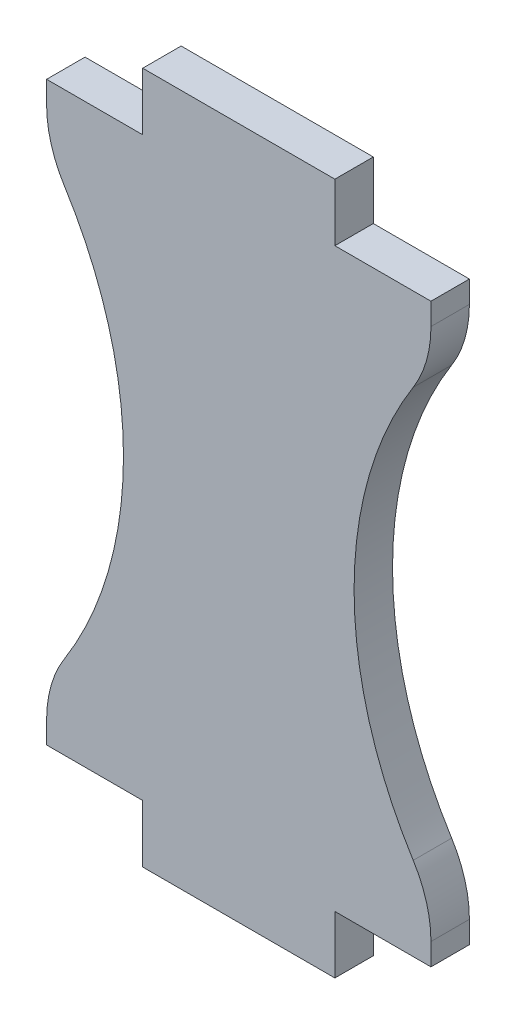
ISO-10303-21;
HEADER;
FILE_DESCRIPTION(('STEP AP214'),'2;1');
FILE_NAME('part.step','',(''),(''),'','','');
FILE_SCHEMA(('AUTOMOTIVE_DESIGN { 1 0 10303 214 1 1 1 1 }'));
ENDSEC;
DATA;
#1=APPLICATION_CONTEXT('core data for automotive mechanical design processes');
#2=APPLICATION_PROTOCOL_DEFINITION('international standard','automotive_design',2000,#1);
#3=PRODUCT_CONTEXT('',#1,'mechanical');
#4=PRODUCT('Part','Part','',(#3));
#5=PRODUCT_RELATED_PRODUCT_CATEGORY('part','',(#4));
#6=PRODUCT_DEFINITION_FORMATION('','',#4);
#7=PRODUCT_DEFINITION_CONTEXT('part definition',#1,'design');
#8=PRODUCT_DEFINITION('design','',#6,#7);
#9=PRODUCT_DEFINITION_SHAPE('','',#8);
#10=(LENGTH_UNIT() NAMED_UNIT(*) SI_UNIT(.MILLI.,.METRE.));
#11=(NAMED_UNIT(*) PLANE_ANGLE_UNIT() SI_UNIT($,.RADIAN.));
#12=(NAMED_UNIT(*) SI_UNIT($,.STERADIAN.) SOLID_ANGLE_UNIT());
#13=UNCERTAINTY_MEASURE_WITH_UNIT(LENGTH_MEASURE(1.E-05),#10,'distance_accuracy_value','');
#14=(GEOMETRIC_REPRESENTATION_CONTEXT(3) GLOBAL_UNCERTAINTY_ASSIGNED_CONTEXT((#13)) GLOBAL_UNIT_ASSIGNED_CONTEXT((#10,
#11,#12)) REPRESENTATION_CONTEXT('',''));
#15=CARTESIAN_POINT('',(0.,0.,0.));
#16=DIRECTION('',(0.,0.,1.));
#17=DIRECTION('',(1.,0.,0.));
#18=AXIS2_PLACEMENT_3D('',#15,#16,#17);
#19=CARTESIAN_POINT('',(26.000000000027,17.9999999999766,2.));
#20=DIRECTION('',(0.,0.,-1.));
#21=DIRECTION('',(-1.,0.,0.));
#22=AXIS2_PLACEMENT_3D('',#19,#20,#21);
#23=CYLINDRICAL_SURFACE('',#22,20.0000000000365);
#24=CARTESIAN_POINT('',(26.000000000027,17.9999999999766,0.));
#25=DIRECTION('',(0.,0.,-1.));
#26=DIRECTION('',(1.,0.,0.));
#27=AXIS2_PLACEMENT_3D('',#24,#25,#26);
#28=CIRCLE('',#27,20.0000000000365);
#29=CARTESIAN_POINT('',(9.07692307692156,7.34122579952961,0.));
#30=VERTEX_POINT('',#29);
#31=CARTESIAN_POINT('',(9.07692307692684,28.658774200432,0.));
#32=VERTEX_POINT('',#31);
#33=EDGE_CURVE('E203',#30,#32,#28,.T.);
#34=ORIENTED_EDGE('',*,*,#33,.T.);
#35=DIRECTION('',(0.,0.,-1.));
#36=VECTOR('',#35,1.);
#37=CARTESIAN_POINT('',(9.07692307692684,28.658774200432,2.));
#38=LINE('',#37,#36);
#39=CARTESIAN_POINT('',(9.07692307692684,28.658774200432,2.));
#40=VERTEX_POINT('',#39);
#41=EDGE_CURVE('E11',#40,#32,#38,.T.);
#42=ORIENTED_EDGE('',*,*,#41,.F.);
#43=CARTESIAN_POINT('',(26.000000000027,17.9999999999766,2.));
#44=DIRECTION('',(0.,0.,-1.));
#45=DIRECTION('',(1.,0.,0.));
#46=AXIS2_PLACEMENT_3D('',#43,#44,#45);
#47=CIRCLE('',#46,20.0000000000365);
#48=CARTESIAN_POINT('',(9.07692307692156,7.34122579952961,2.));
#49=VERTEX_POINT('',#48);
#50=EDGE_CURVE('E241',#49,#40,#47,.T.);
#51=ORIENTED_EDGE('',*,*,#50,.F.);
#52=DIRECTION('',(0.,0.,-1.));
#53=VECTOR('',#52,1.);
#54=CARTESIAN_POINT('',(9.07692307692156,7.34122579952961,2.));
#55=LINE('',#54,#53);
#56=EDGE_CURVE('E199',#49,#30,#55,.T.);
#57=ORIENTED_EDGE('',*,*,#56,.T.);
#58=EDGE_LOOP('',(#34,#42,#51,#57));
#59=FACE_BOUND('',#58,.T.);
#60=ADVANCED_FACE('F35',(#59),#23,.F.);
#61=CARTESIAN_POINT('',(3.99999999993608,31.8564064605722,2.));
#62=DIRECTION('',(0.,0.,-1.));
#63=DIRECTION('',(-1.,0.,0.));
#64=AXIS2_PLACEMENT_3D('',#61,#62,#63);
#65=CYLINDRICAL_SURFACE('',#64,6.00000000006421);
#66=CARTESIAN_POINT('',(3.99999999993608,31.8564064605722,0.));
#67=DIRECTION('',(0.,0.,1.));
#68=DIRECTION('',(1.,0.,0.));
#69=AXIS2_PLACEMENT_3D('',#66,#67,#68);
#70=CIRCLE('',#69,6.00000000006421);
#71=CARTESIAN_POINT('',(10.0000000000003,31.8564064605722,0.));
#72=VERTEX_POINT('',#71);
#73=EDGE_CURVE('E206',#32,#72,#70,.T.);
#74=ORIENTED_EDGE('',*,*,#73,.T.);
#75=DIRECTION('',(0.,0.,-1.));
#76=VECTOR('',#75,1.);
#77=CARTESIAN_POINT('',(10.0000000000003,31.8564064605722,2.));
#78=LINE('',#77,#76);
#79=CARTESIAN_POINT('',(10.0000000000003,31.8564064605722,2.));
#80=VERTEX_POINT('',#79);
#81=EDGE_CURVE('E43',#80,#72,#78,.T.);
#82=ORIENTED_EDGE('',*,*,#81,.F.);
#83=CARTESIAN_POINT('',(3.99999999993608,31.8564064605722,2.));
#84=DIRECTION('',(0.,0.,1.));
#85=DIRECTION('',(1.,0.,0.));
#86=AXIS2_PLACEMENT_3D('',#83,#84,#85);
#87=CIRCLE('',#86,6.00000000006421);
#88=EDGE_CURVE('E130',#40,#80,#87,.T.);
#89=ORIENTED_EDGE('',*,*,#88,.F.);
#90=ORIENTED_EDGE('',*,*,#41,.T.);
#91=EDGE_LOOP('',(#74,#82,#89,#90));
#92=FACE_BOUND('',#91,.T.);
#93=ADVANCED_FACE('F359',(#92),#65,.T.);
#94=CARTESIAN_POINT('',(10.,33.,2.));
#95=DIRECTION('',(-1.,-2.62424673631355E-13,0.));
#96=DIRECTION('',(2.62424673631355E-13,-1.,0.));
#97=AXIS2_PLACEMENT_3D('',#94,#95,#96);
#98=PLANE('',#97);
#99=DIRECTION('',(-2.62424673631355E-13,1.,0.));
#100=VECTOR('',#99,1.);
#101=CARTESIAN_POINT('',(10.,33.,0.));
#102=LINE('',#101,#100);
#103=CARTESIAN_POINT('',(10.,33.,0.));
#104=VERTEX_POINT('',#103);
#105=EDGE_CURVE('E208',#72,#104,#102,.T.);
#106=ORIENTED_EDGE('',*,*,#105,.T.);
#107=DIRECTION('',(0.,0.,-1.));
#108=VECTOR('',#107,1.);
#109=CARTESIAN_POINT('',(10.,33.,2.));
#110=LINE('',#109,#108);
#111=CARTESIAN_POINT('',(10.,33.,2.));
#112=VERTEX_POINT('',#111);
#113=EDGE_CURVE('E284',#112,#104,#110,.T.);
#114=ORIENTED_EDGE('',*,*,#113,.F.);
#115=DIRECTION('',(-2.62424673631355E-13,1.,0.));
#116=VECTOR('',#115,1.);
#117=CARTESIAN_POINT('',(10.,33.,2.));
#118=LINE('',#117,#116);
#119=EDGE_CURVE('E292',#80,#112,#118,.T.);
#120=ORIENTED_EDGE('',*,*,#119,.F.);
#121=ORIENTED_EDGE('',*,*,#81,.T.);
#122=EDGE_LOOP('',(#106,#114,#120,#121));
#123=FACE_BOUND('',#122,.T.);
#124=ADVANCED_FACE('F290',(#123),#98,.F.);
#125=CARTESIAN_POINT('',(5.,33.,2.));
#126=DIRECTION('',(0.,-1.,0.));
#127=DIRECTION('',(0.,0.,-1.));
#128=AXIS2_PLACEMENT_3D('',#125,#126,#127);
#129=PLANE('',#128);
#130=DIRECTION('',(-1.,0.,0.));
#131=VECTOR('',#130,1.);
#132=CARTESIAN_POINT('',(5.,33.,0.));
#133=LINE('',#132,#131);
#134=CARTESIAN_POINT('',(5.,33.,0.));
#135=VERTEX_POINT('',#134);
#136=EDGE_CURVE('E210',#104,#135,#133,.T.);
#137=ORIENTED_EDGE('',*,*,#136,.T.);
#138=DIRECTION('',(0.,0.,-1.));
#139=VECTOR('',#138,1.);
#140=CARTESIAN_POINT('',(5.,33.,2.));
#141=LINE('',#140,#139);
#142=CARTESIAN_POINT('',(5.,33.,2.));
#143=VERTEX_POINT('',#142);
#144=EDGE_CURVE('E281',#143,#135,#141,.T.);
#145=ORIENTED_EDGE('',*,*,#144,.F.);
#146=DIRECTION('',(-1.,0.,0.));
#147=VECTOR('',#146,1.);
#148=CARTESIAN_POINT('',(5.,33.,2.));
#149=LINE('',#148,#147);
#150=EDGE_CURVE('E310',#112,#143,#149,.T.);
#151=ORIENTED_EDGE('',*,*,#150,.F.);
#152=ORIENTED_EDGE('',*,*,#113,.T.);
#153=EDGE_LOOP('',(#137,#145,#151,#152));
#154=FACE_BOUND('',#153,.T.);
#155=ADVANCED_FACE('F301',(#154),#129,.F.);
#156=CARTESIAN_POINT('',(5.,36.,2.));
#157=DIRECTION('',(-1.,0.,0.));
#158=DIRECTION('',(0.,0.,1.));
#159=AXIS2_PLACEMENT_3D('',#156,#157,#158);
#160=PLANE('',#159);
#161=DIRECTION('',(0.,1.,0.));
#162=VECTOR('',#161,1.);
#163=CARTESIAN_POINT('',(5.,36.,0.));
#164=LINE('',#163,#162);
#165=CARTESIAN_POINT('',(5.,36.,0.));
#166=VERTEX_POINT('',#165);
#167=EDGE_CURVE('E212',#135,#166,#164,.T.);
#168=ORIENTED_EDGE('',*,*,#167,.T.);
#169=DIRECTION('',(0.,0.,-1.));
#170=VECTOR('',#169,1.);
#171=CARTESIAN_POINT('',(5.,36.,2.));
#172=LINE('',#171,#170);
#173=CARTESIAN_POINT('',(5.,36.,2.));
#174=VERTEX_POINT('',#173);
#175=EDGE_CURVE('E278',#174,#166,#172,.T.);
#176=ORIENTED_EDGE('',*,*,#175,.F.);
#177=DIRECTION('',(0.,1.,0.));
#178=VECTOR('',#177,1.);
#179=CARTESIAN_POINT('',(5.,36.,2.));
#180=LINE('',#179,#178);
#181=EDGE_CURVE('E307',#143,#174,#180,.T.);
#182=ORIENTED_EDGE('',*,*,#181,.F.);
#183=ORIENTED_EDGE('',*,*,#144,.T.);
#184=EDGE_LOOP('',(#168,#176,#182,#183));
#185=FACE_BOUND('',#184,.T.);
#186=ADVANCED_FACE('F305',(#185),#160,.F.);
#187=CARTESIAN_POINT('',(-5.,36.,2.));
#188=DIRECTION('',(0.,-1.,0.));
#189=DIRECTION('',(0.,0.,-1.));
#190=AXIS2_PLACEMENT_3D('',#187,#188,#189);
#191=PLANE('',#190);
#192=DIRECTION('',(-1.,0.,0.));
#193=VECTOR('',#192,1.);
#194=CARTESIAN_POINT('',(-5.,36.,0.));
#195=LINE('',#194,#193);
#196=CARTESIAN_POINT('',(-5.,36.,0.));
#197=VERTEX_POINT('',#196);
#198=EDGE_CURVE('E214',#166,#197,#195,.T.);
#199=ORIENTED_EDGE('',*,*,#198,.T.);
#200=DIRECTION('',(0.,0.,-1.));
#201=VECTOR('',#200,1.);
#202=CARTESIAN_POINT('',(-5.,36.,2.));
#203=LINE('',#202,#201);
#204=CARTESIAN_POINT('',(-5.,36.,2.));
#205=VERTEX_POINT('',#204);
#206=EDGE_CURVE('E275',#205,#197,#203,.T.);
#207=ORIENTED_EDGE('',*,*,#206,.F.);
#208=DIRECTION('',(-1.,0.,0.));
#209=VECTOR('',#208,1.);
#210=CARTESIAN_POINT('',(-5.,36.,2.));
#211=LINE('',#210,#209);
#212=EDGE_CURVE('E309',#174,#205,#211,.T.);
#213=ORIENTED_EDGE('',*,*,#212,.F.);
#214=ORIENTED_EDGE('',*,*,#175,.T.);
#215=EDGE_LOOP('',(#199,#207,#213,#214));
#216=FACE_BOUND('',#215,.T.);
#217=ADVANCED_FACE('F372',(#216),#191,.F.);
#218=CARTESIAN_POINT('',(-5.,33.,2.));
#219=DIRECTION('',(1.,0.,0.));
#220=DIRECTION('',(0.,0.,-1.));
#221=AXIS2_PLACEMENT_3D('',#218,#219,#220);
#222=PLANE('',#221);
#223=DIRECTION('',(0.,-1.,0.));
#224=VECTOR('',#223,1.);
#225=CARTESIAN_POINT('',(-5.,33.,0.));
#226=LINE('',#225,#224);
#227=CARTESIAN_POINT('',(-5.,33.,0.));
#228=VERTEX_POINT('',#227);
#229=EDGE_CURVE('E216',#197,#228,#226,.T.);
#230=ORIENTED_EDGE('',*,*,#229,.T.);
#231=DIRECTION('',(0.,0.,-1.));
#232=VECTOR('',#231,1.);
#233=CARTESIAN_POINT('',(-5.,33.,2.));
#234=LINE('',#233,#232);
#235=CARTESIAN_POINT('',(-5.,33.,2.));
#236=VERTEX_POINT('',#235);
#237=EDGE_CURVE('E272',#236,#228,#234,.T.);
#238=ORIENTED_EDGE('',*,*,#237,.F.);
#239=DIRECTION('',(0.,-1.,0.));
#240=VECTOR('',#239,1.);
#241=CARTESIAN_POINT('',(-5.,33.,2.));
#242=LINE('',#241,#240);
#243=EDGE_CURVE('E312',#205,#236,#242,.T.);
#244=ORIENTED_EDGE('',*,*,#243,.F.);
#245=ORIENTED_EDGE('',*,*,#206,.T.);
#246=EDGE_LOOP('',(#230,#238,#244,#245));
#247=FACE_BOUND('',#246,.T.);
#248=ADVANCED_FACE('F375',(#247),#222,.F.);
#249=CARTESIAN_POINT('',(-10.,33.,2.));
#250=DIRECTION('',(0.,-1.,0.));
#251=DIRECTION('',(0.,0.,-1.));
#252=AXIS2_PLACEMENT_3D('',#249,#250,#251);
#253=PLANE('',#252);
#254=DIRECTION('',(-1.,0.,0.));
#255=VECTOR('',#254,1.);
#256=CARTESIAN_POINT('',(-10.,33.,0.));
#257=LINE('',#256,#255);
#258=CARTESIAN_POINT('',(-10.,33.,0.));
#259=VERTEX_POINT('',#258);
#260=EDGE_CURVE('E218',#228,#259,#257,.T.);
#261=ORIENTED_EDGE('',*,*,#260,.T.);
#262=DIRECTION('',(0.,0.,-1.));
#263=VECTOR('',#262,1.);
#264=CARTESIAN_POINT('',(-10.,33.,2.));
#265=LINE('',#264,#263);
#266=CARTESIAN_POINT('',(-10.,33.,2.));
#267=VERTEX_POINT('',#266);
#268=EDGE_CURVE('E269',#267,#259,#265,.T.);
#269=ORIENTED_EDGE('',*,*,#268,.F.);
#270=DIRECTION('',(-1.,0.,0.));
#271=VECTOR('',#270,1.);
#272=CARTESIAN_POINT('',(-10.,33.,2.));
#273=LINE('',#272,#271);
#274=EDGE_CURVE('E318',#236,#267,#273,.T.);
#275=ORIENTED_EDGE('',*,*,#274,.F.);
#276=ORIENTED_EDGE('',*,*,#237,.T.);
#277=EDGE_LOOP('',(#261,#269,#275,#276));
#278=FACE_BOUND('',#277,.T.);
#279=ADVANCED_FACE('F379',(#278),#253,.F.);
#280=CARTESIAN_POINT('',(-10.,31.8564064605999,2.));
#281=DIRECTION('',(1.,0.,0.));
#282=DIRECTION('',(0.,0.,-1.));
#283=AXIS2_PLACEMENT_3D('',#280,#281,#282);
#284=PLANE('',#283);
#285=DIRECTION('',(0.,-1.,0.));
#286=VECTOR('',#285,1.);
#287=CARTESIAN_POINT('',(-10.,31.8564064605999,0.));
#288=LINE('',#287,#286);
#289=CARTESIAN_POINT('',(-10.,31.8564064605999,0.));
#290=VERTEX_POINT('',#289);
#291=EDGE_CURVE('E220',#259,#290,#288,.T.);
#292=ORIENTED_EDGE('',*,*,#291,.T.);
#293=DIRECTION('',(0.,0.,-1.));
#294=VECTOR('',#293,1.);
#295=CARTESIAN_POINT('',(-10.,31.8564064605999,2.));
#296=LINE('',#295,#294);
#297=CARTESIAN_POINT('',(-10.,31.8564064605999,2.));
#298=VERTEX_POINT('',#297);
#299=EDGE_CURVE('E266',#298,#290,#296,.T.);
#300=ORIENTED_EDGE('',*,*,#299,.F.);
#301=DIRECTION('',(0.,-1.,0.));
#302=VECTOR('',#301,1.);
#303=CARTESIAN_POINT('',(-10.,31.8564064605999,2.));
#304=LINE('',#303,#302);
#305=EDGE_CURVE('E320',#267,#298,#304,.T.);
#306=ORIENTED_EDGE('',*,*,#305,.F.);
#307=ORIENTED_EDGE('',*,*,#268,.T.);
#308=EDGE_LOOP('',(#292,#300,#306,#307));
#309=FACE_BOUND('',#308,.T.);
#310=ADVANCED_FACE('F383',(#309),#284,.F.);
#311=CARTESIAN_POINT('',(-3.99999999914053,31.8564064576226,2.));
#312=DIRECTION('',(0.,0.,-1.));
#313=DIRECTION('',(-1.,0.,0.));
#314=AXIS2_PLACEMENT_3D('',#311,#312,#313);
#315=CYLINDRICAL_SURFACE('',#314,6.00000000085947);
#316=CARTESIAN_POINT('',(-3.99999999914053,31.8564064576226,0.));
#317=DIRECTION('',(0.,0.,1.));
#318=DIRECTION('',(1.,0.,0.));
#319=AXIS2_PLACEMENT_3D('',#316,#317,#318);
#320=CIRCLE('',#319,6.00000000085947);
#321=CARTESIAN_POINT('',(-9.07692307846614,28.6587741996972,0.));
#322=VERTEX_POINT('',#321);
#323=EDGE_CURVE('E222',#290,#322,#320,.T.);
#324=ORIENTED_EDGE('',*,*,#323,.T.);
#325=DIRECTION('',(0.,0.,-1.));
#326=VECTOR('',#325,1.);
#327=CARTESIAN_POINT('',(-9.07692307846614,28.6587741996972,2.));
#328=LINE('',#327,#326);
#329=CARTESIAN_POINT('',(-9.07692307846614,28.6587741996972,2.));
#330=VERTEX_POINT('',#329);
#331=EDGE_CURVE('E263',#330,#322,#328,.T.);
#332=ORIENTED_EDGE('',*,*,#331,.F.);
#333=CARTESIAN_POINT('',(-3.99999999914053,31.8564064576226,2.));
#334=DIRECTION('',(0.,0.,1.));
#335=DIRECTION('',(1.,0.,0.));
#336=AXIS2_PLACEMENT_3D('',#333,#334,#335);
#337=CIRCLE('',#336,6.00000000085947);
#338=EDGE_CURVE('E322',#298,#330,#337,.T.);
#339=ORIENTED_EDGE('',*,*,#338,.F.);
#340=ORIENTED_EDGE('',*,*,#299,.T.);
#341=EDGE_LOOP('',(#324,#332,#339,#340));
#342=FACE_BOUND('',#341,.T.);
#343=ADVANCED_FACE('F387',(#342),#315,.T.);
#344=CARTESIAN_POINT('',(-26.0000000001856,17.9999999984106,2.));
#345=DIRECTION('',(0.,0.,-1.));
#346=DIRECTION('',(-1.,0.,0.));
#347=AXIS2_PLACEMENT_3D('',#344,#345,#346);
#348=CYLINDRICAL_SURFACE('',#347,19.9999999993111);
#349=CARTESIAN_POINT('',(-26.0000000001856,17.9999999984106,0.));
#350=DIRECTION('',(0.,0.,-1.));
#351=DIRECTION('',(1.,0.,0.));
#352=AXIS2_PLACEMENT_3D('',#349,#350,#351);
#353=CIRCLE('',#352,19.9999999993111);
#354=CARTESIAN_POINT('',(-9.07692307692687,7.34122579956794,0.));
#355=VERTEX_POINT('',#354);
#356=EDGE_CURVE('E224',#322,#355,#353,.T.);
#357=ORIENTED_EDGE('',*,*,#356,.T.);
#358=DIRECTION('',(0.,0.,-1.));
#359=VECTOR('',#358,1.);
#360=CARTESIAN_POINT('',(-9.07692307692687,7.34122579956794,2.));
#361=LINE('',#360,#359);
#362=CARTESIAN_POINT('',(-9.07692307692687,7.34122579956794,2.));
#363=VERTEX_POINT('',#362);
#364=EDGE_CURVE('E260',#363,#355,#361,.T.);
#365=ORIENTED_EDGE('',*,*,#364,.F.);
#366=CARTESIAN_POINT('',(-26.0000000001856,17.9999999984106,2.));
#367=DIRECTION('',(0.,0.,-1.));
#368=DIRECTION('',(1.,0.,0.));
#369=AXIS2_PLACEMENT_3D('',#366,#367,#368);
#370=CIRCLE('',#369,19.9999999993111);
#371=EDGE_CURVE('E324',#330,#363,#370,.T.);
#372=ORIENTED_EDGE('',*,*,#371,.F.);
#373=ORIENTED_EDGE('',*,*,#331,.T.);
#374=EDGE_LOOP('',(#357,#365,#372,#373));
#375=FACE_BOUND('',#374,.T.);
#376=ADVANCED_FACE('F391',(#375),#348,.F.);
#377=CARTESIAN_POINT('',(-3.99999999993592,4.14359353942772,2.));
#378=DIRECTION('',(0.,0.,-1.));
#379=DIRECTION('',(-1.,0.,0.));
#380=AXIS2_PLACEMENT_3D('',#377,#378,#379);
#381=CYLINDRICAL_SURFACE('',#380,6.00000000006439);
#382=CARTESIAN_POINT('',(-3.99999999993592,4.14359353942772,0.));
#383=DIRECTION('',(0.,0.,1.));
#384=DIRECTION('',(1.,0.,0.));
#385=AXIS2_PLACEMENT_3D('',#382,#383,#384);
#386=CIRCLE('',#385,6.00000000006439);
#387=CARTESIAN_POINT('',(-10.0000000000003,4.14359353923091,0.));
#388=VERTEX_POINT('',#387);
#389=EDGE_CURVE('E226',#355,#388,#386,.T.);
#390=ORIENTED_EDGE('',*,*,#389,.T.);
#391=DIRECTION('',(0.,0.,-1.));
#392=VECTOR('',#391,1.);
#393=CARTESIAN_POINT('',(-10.0000000000003,4.14359353923091,2.));
#394=LINE('',#393,#392);
#395=CARTESIAN_POINT('',(-10.0000000000003,4.14359353923091,2.));
#396=VERTEX_POINT('',#395);
#397=EDGE_CURVE('E257',#396,#388,#394,.T.);
#398=ORIENTED_EDGE('',*,*,#397,.F.);
#399=CARTESIAN_POINT('',(-3.99999999993592,4.14359353942772,2.));
#400=DIRECTION('',(0.,0.,1.));
#401=DIRECTION('',(1.,0.,0.));
#402=AXIS2_PLACEMENT_3D('',#399,#400,#401);
#403=CIRCLE('',#402,6.00000000006439);
#404=EDGE_CURVE('E326',#363,#396,#403,.T.);
#405=ORIENTED_EDGE('',*,*,#404,.F.);
#406=ORIENTED_EDGE('',*,*,#364,.T.);
#407=EDGE_LOOP('',(#390,#398,#405,#406));
#408=FACE_BOUND('',#407,.T.);
#409=ADVANCED_FACE('F395',(#408),#381,.T.);
#410=CARTESIAN_POINT('',(-10.,3.,2.));
#411=DIRECTION('',(1.,2.7152610743908E-13,0.));
#412=DIRECTION('',(-2.7152610743908E-13,1.,0.));
#413=AXIS2_PLACEMENT_3D('',#410,#411,#412);
#414=PLANE('',#413);
#415=DIRECTION('',(2.7152610743908E-13,-1.,0.));
#416=VECTOR('',#415,1.);
#417=CARTESIAN_POINT('',(-10.,3.,0.));
#418=LINE('',#417,#416);
#419=CARTESIAN_POINT('',(-10.,3.,0.));
#420=VERTEX_POINT('',#419);
#421=EDGE_CURVE('E228',#388,#420,#418,.T.);
#422=ORIENTED_EDGE('',*,*,#421,.T.);
#423=DIRECTION('',(0.,0.,-1.));
#424=VECTOR('',#423,1.);
#425=CARTESIAN_POINT('',(-10.,3.,2.));
#426=LINE('',#425,#424);
#427=CARTESIAN_POINT('',(-10.,3.,2.));
#428=VERTEX_POINT('',#427);
#429=EDGE_CURVE('E254',#428,#420,#426,.T.);
#430=ORIENTED_EDGE('',*,*,#429,.F.);
#431=DIRECTION('',(2.7152610743908E-13,-1.,0.));
#432=VECTOR('',#431,1.);
#433=CARTESIAN_POINT('',(-10.,3.,2.));
#434=LINE('',#433,#432);
#435=EDGE_CURVE('E328',#396,#428,#434,.T.);
#436=ORIENTED_EDGE('',*,*,#435,.F.);
#437=ORIENTED_EDGE('',*,*,#397,.T.);
#438=EDGE_LOOP('',(#422,#430,#436,#437));
#439=FACE_BOUND('',#438,.T.);
#440=ADVANCED_FACE('F399',(#439),#414,.F.);
#441=CARTESIAN_POINT('',(-5.,3.,2.));
#442=DIRECTION('',(0.,1.,0.));
#443=DIRECTION('',(0.,0.,1.));
#444=AXIS2_PLACEMENT_3D('',#441,#442,#443);
#445=PLANE('',#444);
#446=DIRECTION('',(1.,0.,0.));
#447=VECTOR('',#446,1.);
#448=CARTESIAN_POINT('',(-5.,3.,0.));
#449=LINE('',#448,#447);
#450=CARTESIAN_POINT('',(-5.,3.,0.));
#451=VERTEX_POINT('',#450);
#452=EDGE_CURVE('E230',#420,#451,#449,.T.);
#453=ORIENTED_EDGE('',*,*,#452,.T.);
#454=DIRECTION('',(0.,0.,-1.));
#455=VECTOR('',#454,1.);
#456=CARTESIAN_POINT('',(-5.,3.,2.));
#457=LINE('',#456,#455);
#458=CARTESIAN_POINT('',(-5.,3.,2.));
#459=VERTEX_POINT('',#458);
#460=EDGE_CURVE('E251',#459,#451,#457,.T.);
#461=ORIENTED_EDGE('',*,*,#460,.F.);
#462=DIRECTION('',(1.,0.,0.));
#463=VECTOR('',#462,1.);
#464=CARTESIAN_POINT('',(-5.,3.,2.));
#465=LINE('',#464,#463);
#466=EDGE_CURVE('E330',#428,#459,#465,.T.);
#467=ORIENTED_EDGE('',*,*,#466,.F.);
#468=ORIENTED_EDGE('',*,*,#429,.T.);
#469=EDGE_LOOP('',(#453,#461,#467,#468));
#470=FACE_BOUND('',#469,.T.);
#471=ADVANCED_FACE('F403',(#470),#445,.F.);
#472=CARTESIAN_POINT('',(-5.,0.,2.));
#473=DIRECTION('',(1.,0.,0.));
#474=DIRECTION('',(0.,0.,-1.));
#475=AXIS2_PLACEMENT_3D('',#472,#473,#474);
#476=PLANE('',#475);
#477=DIRECTION('',(0.,-1.,0.));
#478=VECTOR('',#477,1.);
#479=CARTESIAN_POINT('',(-5.,0.,0.));
#480=LINE('',#479,#478);
#481=CARTESIAN_POINT('',(-5.,0.,0.));
#482=VERTEX_POINT('',#481);
#483=EDGE_CURVE('E232',#451,#482,#480,.T.);
#484=ORIENTED_EDGE('',*,*,#483,.T.);
#485=DIRECTION('',(0.,0.,-1.));
#486=VECTOR('',#485,1.);
#487=CARTESIAN_POINT('',(-5.,0.,2.));
#488=LINE('',#487,#486);
#489=CARTESIAN_POINT('',(-5.,0.,2.));
#490=VERTEX_POINT('',#489);
#491=EDGE_CURVE('E248',#490,#482,#488,.T.);
#492=ORIENTED_EDGE('',*,*,#491,.F.);
#493=DIRECTION('',(0.,-1.,0.));
#494=VECTOR('',#493,1.);
#495=CARTESIAN_POINT('',(-5.,0.,2.));
#496=LINE('',#495,#494);
#497=EDGE_CURVE('E332',#459,#490,#496,.T.);
#498=ORIENTED_EDGE('',*,*,#497,.F.);
#499=ORIENTED_EDGE('',*,*,#460,.T.);
#500=EDGE_LOOP('',(#484,#492,#498,#499));
#501=FACE_BOUND('',#500,.T.);
#502=ADVANCED_FACE('F407',(#501),#476,.F.);
#503=CARTESIAN_POINT('',(5.,0.,2.));
#504=DIRECTION('',(0.,1.,0.));
#505=DIRECTION('',(0.,0.,1.));
#506=AXIS2_PLACEMENT_3D('',#503,#504,#505);
#507=PLANE('',#506);
#508=DIRECTION('',(1.,0.,0.));
#509=VECTOR('',#508,1.);
#510=CARTESIAN_POINT('',(5.,0.,0.));
#511=LINE('',#510,#509);
#512=CARTESIAN_POINT('',(5.,0.,0.));
#513=VERTEX_POINT('',#512);
#514=EDGE_CURVE('E234',#482,#513,#511,.T.);
#515=ORIENTED_EDGE('',*,*,#514,.T.);
#516=DIRECTION('',(0.,0.,-1.));
#517=VECTOR('',#516,1.);
#518=CARTESIAN_POINT('',(5.,0.,2.));
#519=LINE('',#518,#517);
#520=CARTESIAN_POINT('',(5.,0.,2.));
#521=VERTEX_POINT('',#520);
#522=EDGE_CURVE('E245',#521,#513,#519,.T.);
#523=ORIENTED_EDGE('',*,*,#522,.F.);
#524=DIRECTION('',(1.,0.,0.));
#525=VECTOR('',#524,1.);
#526=CARTESIAN_POINT('',(5.,0.,2.));
#527=LINE('',#526,#525);
#528=EDGE_CURVE('E334',#490,#521,#527,.T.);
#529=ORIENTED_EDGE('',*,*,#528,.F.);
#530=ORIENTED_EDGE('',*,*,#491,.T.);
#531=EDGE_LOOP('',(#515,#523,#529,#530));
#532=FACE_BOUND('',#531,.T.);
#533=ADVANCED_FACE('F340',(#532),#507,.F.);
#534=CARTESIAN_POINT('',(5.,3.,2.));
#535=DIRECTION('',(-1.,0.,0.));
#536=DIRECTION('',(0.,0.,1.));
#537=AXIS2_PLACEMENT_3D('',#534,#535,#536);
#538=PLANE('',#537);
#539=DIRECTION('',(0.,1.,0.));
#540=VECTOR('',#539,1.);
#541=CARTESIAN_POINT('',(5.,3.,0.));
#542=LINE('',#541,#540);
#543=CARTESIAN_POINT('',(5.,3.,0.));
#544=VERTEX_POINT('',#543);
#545=EDGE_CURVE('E236',#513,#544,#542,.T.);
#546=ORIENTED_EDGE('',*,*,#545,.T.);
#547=DIRECTION('',(0.,0.,-1.));
#548=VECTOR('',#547,1.);
#549=CARTESIAN_POINT('',(5.,3.,2.));
#550=LINE('',#549,#548);
#551=CARTESIAN_POINT('',(5.,3.,2.));
#552=VERTEX_POINT('',#551);
#553=EDGE_CURVE('E194',#552,#544,#550,.T.);
#554=ORIENTED_EDGE('',*,*,#553,.F.);
#555=DIRECTION('',(0.,1.,0.));
#556=VECTOR('',#555,1.);
#557=CARTESIAN_POINT('',(5.,3.,2.));
#558=LINE('',#557,#556);
#559=EDGE_CURVE('E185',#521,#552,#558,.T.);
#560=ORIENTED_EDGE('',*,*,#559,.F.);
#561=ORIENTED_EDGE('',*,*,#522,.T.);
#562=EDGE_LOOP('',(#546,#554,#560,#561));
#563=FACE_BOUND('',#562,.T.);
#564=ADVANCED_FACE('F344',(#563),#538,.F.);
#565=CARTESIAN_POINT('',(10.,3.,2.));
#566=DIRECTION('',(0.,1.,0.));
#567=DIRECTION('',(0.,0.,1.));
#568=AXIS2_PLACEMENT_3D('',#565,#566,#567);
#569=PLANE('',#568);
#570=DIRECTION('',(1.,0.,0.));
#571=VECTOR('',#570,1.);
#572=CARTESIAN_POINT('',(10.,3.,0.));
#573=LINE('',#572,#571);
#574=CARTESIAN_POINT('',(10.,3.,0.));
#575=VERTEX_POINT('',#574);
#576=EDGE_CURVE('E193',#544,#575,#573,.T.);
#577=ORIENTED_EDGE('',*,*,#576,.T.);
#578=DIRECTION('',(0.,0.,-1.));
#579=VECTOR('',#578,1.);
#580=CARTESIAN_POINT('',(10.,3.,2.));
#581=LINE('',#580,#579);
#582=CARTESIAN_POINT('',(10.,3.,2.));
#583=VERTEX_POINT('',#582);
#584=EDGE_CURVE('E190',#583,#575,#581,.T.);
#585=ORIENTED_EDGE('',*,*,#584,.F.);
#586=DIRECTION('',(1.,0.,0.));
#587=VECTOR('',#586,1.);
#588=CARTESIAN_POINT('',(10.,3.,2.));
#589=LINE('',#588,#587);
#590=EDGE_CURVE('E179',#552,#583,#589,.T.);
#591=ORIENTED_EDGE('',*,*,#590,.F.);
#592=ORIENTED_EDGE('',*,*,#553,.T.);
#593=EDGE_LOOP('',(#577,#585,#591,#592));
#594=FACE_BOUND('',#593,.T.);
#595=ADVANCED_FACE('F191',(#594),#569,.F.);
#596=CARTESIAN_POINT('',(10.,4.14359353939994,2.));
#597=DIRECTION('',(-1.,0.,0.));
#598=DIRECTION('',(0.,0.,1.));
#599=AXIS2_PLACEMENT_3D('',#596,#597,#598);
#600=PLANE('',#599);
#601=DIRECTION('',(0.,1.,0.));
#602=VECTOR('',#601,1.);
#603=CARTESIAN_POINT('',(10.,4.14359353939994,0.));
#604=LINE('',#603,#602);
#605=CARTESIAN_POINT('',(10.,4.14359353939994,0.));
#606=VERTEX_POINT('',#605);
#607=EDGE_CURVE('E116',#575,#606,#604,.T.);
#608=ORIENTED_EDGE('',*,*,#607,.T.);
#609=DIRECTION('',(0.,0.,-1.));
#610=VECTOR('',#609,1.);
#611=CARTESIAN_POINT('',(10.,4.14359353939994,2.));
#612=LINE('',#611,#610);
#613=CARTESIAN_POINT('',(10.,4.14359353939994,2.));
#614=VERTEX_POINT('',#613);
#615=EDGE_CURVE('E195',#614,#606,#612,.T.);
#616=ORIENTED_EDGE('',*,*,#615,.F.);
#617=DIRECTION('',(0.,1.,0.));
#618=VECTOR('',#617,1.);
#619=CARTESIAN_POINT('',(10.,4.14359353939994,2.));
#620=LINE('',#619,#618);
#621=EDGE_CURVE('E183',#583,#614,#620,.T.);
#622=ORIENTED_EDGE('',*,*,#621,.F.);
#623=ORIENTED_EDGE('',*,*,#584,.T.);
#624=EDGE_LOOP('',(#608,#616,#622,#623));
#625=FACE_BOUND('',#624,.T.);
#626=ADVANCED_FACE('F197',(#625),#600,.F.);
#627=CARTESIAN_POINT('',(3.99999999999998,4.14359353940003,2.));
#628=DIRECTION('',(0.,0.,-1.));
#629=DIRECTION('',(-1.,0.,0.));
#630=AXIS2_PLACEMENT_3D('',#627,#628,#629);
#631=CYLINDRICAL_SURFACE('',#630,6.00000000000002);
#632=CARTESIAN_POINT('',(3.99999999999998,4.14359353940003,0.));
#633=DIRECTION('',(0.,0.,1.));
#634=DIRECTION('',(1.,0.,0.));
#635=AXIS2_PLACEMENT_3D('',#632,#633,#634);
#636=CIRCLE('',#635,6.00000000000002);
#637=EDGE_CURVE('E122',#606,#30,#636,.T.);
#638=ORIENTED_EDGE('',*,*,#637,.T.);
#639=ORIENTED_EDGE('',*,*,#56,.F.);
#640=CARTESIAN_POINT('',(3.99999999999998,4.14359353940003,2.));
#641=DIRECTION('',(0.,0.,1.));
#642=DIRECTION('',(1.,0.,0.));
#643=AXIS2_PLACEMENT_3D('',#640,#641,#642);
#644=CIRCLE('',#643,6.00000000000002);
#645=EDGE_CURVE('E51',#614,#49,#644,.T.);
#646=ORIENTED_EDGE('',*,*,#645,.F.);
#647=ORIENTED_EDGE('',*,*,#615,.T.);
#648=EDGE_LOOP('',(#638,#639,#646,#647));
#649=FACE_BOUND('',#648,.T.);
#650=ADVANCED_FACE('F348',(#649),#631,.T.);
#651=CARTESIAN_POINT('',(26.000000000027,17.9999999999766,2.));
#652=DIRECTION('',(0.,0.,1.));
#653=DIRECTION('',(1.,0.,0.));
#654=AXIS2_PLACEMENT_3D('',#651,#652,#653);
#655=PLANE('',#654);
#656=ORIENTED_EDGE('',*,*,#50,.T.);
#657=ORIENTED_EDGE('',*,*,#88,.T.);
#658=ORIENTED_EDGE('',*,*,#119,.T.);
#659=ORIENTED_EDGE('',*,*,#150,.T.);
#660=ORIENTED_EDGE('',*,*,#181,.T.);
#661=ORIENTED_EDGE('',*,*,#212,.T.);
#662=ORIENTED_EDGE('',*,*,#243,.T.);
#663=ORIENTED_EDGE('',*,*,#274,.T.);
#664=ORIENTED_EDGE('',*,*,#305,.T.);
#665=ORIENTED_EDGE('',*,*,#338,.T.);
#666=ORIENTED_EDGE('',*,*,#371,.T.);
#667=ORIENTED_EDGE('',*,*,#404,.T.);
#668=ORIENTED_EDGE('',*,*,#435,.T.);
#669=ORIENTED_EDGE('',*,*,#466,.T.);
#670=ORIENTED_EDGE('',*,*,#497,.T.);
#671=ORIENTED_EDGE('',*,*,#528,.T.);
#672=ORIENTED_EDGE('',*,*,#559,.T.);
#673=ORIENTED_EDGE('',*,*,#590,.T.);
#674=ORIENTED_EDGE('',*,*,#621,.T.);
#675=ORIENTED_EDGE('',*,*,#645,.T.);
#676=EDGE_LOOP('',(#656,#657,#658,#659,#660,#661,#662,#663,#664,#665,#666,#667,#668,#669,#670,
#671,#672,#673,#674,#675));
#677=FACE_BOUND('',#676,.T.);
#678=ADVANCED_FACE('F181',(#677),#655,.T.);
#679=CARTESIAN_POINT('',(26.000000000027,17.9999999999766,0.));
#680=DIRECTION('',(0.,0.,1.));
#681=DIRECTION('',(1.,0.,0.));
#682=AXIS2_PLACEMENT_3D('',#679,#680,#681);
#683=PLANE('',#682);
#684=ORIENTED_EDGE('',*,*,#33,.F.);
#685=ORIENTED_EDGE('',*,*,#637,.F.);
#686=ORIENTED_EDGE('',*,*,#607,.F.);
#687=ORIENTED_EDGE('',*,*,#576,.F.);
#688=ORIENTED_EDGE('',*,*,#545,.F.);
#689=ORIENTED_EDGE('',*,*,#514,.F.);
#690=ORIENTED_EDGE('',*,*,#483,.F.);
#691=ORIENTED_EDGE('',*,*,#452,.F.);
#692=ORIENTED_EDGE('',*,*,#421,.F.);
#693=ORIENTED_EDGE('',*,*,#389,.F.);
#694=ORIENTED_EDGE('',*,*,#356,.F.);
#695=ORIENTED_EDGE('',*,*,#323,.F.);
#696=ORIENTED_EDGE('',*,*,#291,.F.);
#697=ORIENTED_EDGE('',*,*,#260,.F.);
#698=ORIENTED_EDGE('',*,*,#229,.F.);
#699=ORIENTED_EDGE('',*,*,#198,.F.);
#700=ORIENTED_EDGE('',*,*,#167,.F.);
#701=ORIENTED_EDGE('',*,*,#136,.F.);
#702=ORIENTED_EDGE('',*,*,#105,.F.);
#703=ORIENTED_EDGE('',*,*,#73,.F.);
#704=EDGE_LOOP('',(#684,#685,#686,#687,#688,#689,#690,#691,#692,#693,#694,#695,#696,#697,#698,
#699,#700,#701,#702,#703));
#705=FACE_BOUND('',#704,.T.);
#706=ADVANCED_FACE('F296',(#705),#683,.F.);
#707=CLOSED_SHELL('',(#60,#93,#124,#155,#186,#217,#248,#279,#310,#343,#376,#409,#440,#471,#502,
#533,#564,#595,#626,#650,#678,#706));
#708=MANIFOLD_SOLID_BREP('B2',#707);
#709=ADVANCED_BREP_SHAPE_REPRESENTATION('',(#18,#708),#14);
#710=SHAPE_DEFINITION_REPRESENTATION(#9,#709);
ENDSEC;
END-ISO-10303-21;
